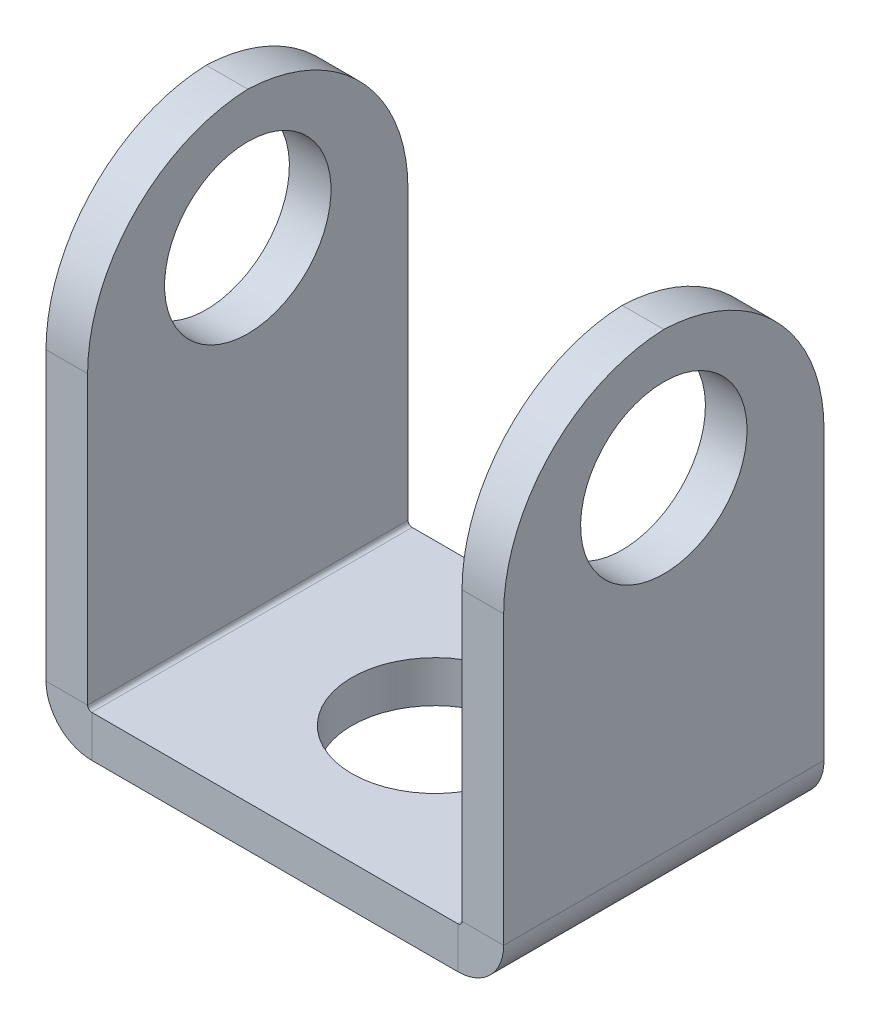
ISO-10303-21;
HEADER;
FILE_DESCRIPTION(('STEP AP214'),'2;1');
FILE_NAME('part.step','',(''),(''),'','','');
FILE_SCHEMA(('AUTOMOTIVE_DESIGN { 1 0 10303 214 1 1 1 1 }'));
ENDSEC;
DATA;
#1=APPLICATION_CONTEXT('core data for automotive mechanical design processes');
#2=APPLICATION_PROTOCOL_DEFINITION('international standard','automotive_design',2000,#1);
#3=PRODUCT_CONTEXT('',#1,'mechanical');
#4=PRODUCT('Part','Part','',(#3));
#5=PRODUCT_RELATED_PRODUCT_CATEGORY('part','',(#4));
#6=PRODUCT_DEFINITION_FORMATION('','',#4);
#7=PRODUCT_DEFINITION_CONTEXT('part definition',#1,'design');
#8=PRODUCT_DEFINITION('design','',#6,#7);
#9=PRODUCT_DEFINITION_SHAPE('','',#8);
#10=(LENGTH_UNIT() NAMED_UNIT(*) SI_UNIT(.MILLI.,.METRE.));
#11=(NAMED_UNIT(*) PLANE_ANGLE_UNIT() SI_UNIT($,.RADIAN.));
#12=(NAMED_UNIT(*) SI_UNIT($,.STERADIAN.) SOLID_ANGLE_UNIT());
#13=UNCERTAINTY_MEASURE_WITH_UNIT(LENGTH_MEASURE(1.E-05),#10,'distance_accuracy_value','');
#14=(GEOMETRIC_REPRESENTATION_CONTEXT(3) GLOBAL_UNCERTAINTY_ASSIGNED_CONTEXT((#13)) GLOBAL_UNIT_ASSIGNED_CONTEXT((#10,
#11,#12)) REPRESENTATION_CONTEXT('',''));
#15=CARTESIAN_POINT('',(0.,0.,0.));
#16=DIRECTION('',(0.,0.,1.));
#17=DIRECTION('',(1.,0.,0.));
#18=AXIS2_PLACEMENT_3D('',#15,#16,#17);
#19=CARTESIAN_POINT('',(4.5,1.,3.85));
#20=DIRECTION('',(0.,1.,0.));
#21=DIRECTION('',(0.,0.,1.));
#22=AXIS2_PLACEMENT_3D('',#19,#20,#21);
#23=PLANE('',#22);
#24=CARTESIAN_POINT('',(0.,1.,0.));
#25=DIRECTION('',(0.,1.,0.));
#26=DIRECTION('',(0.,0.,1.));
#27=AXIS2_PLACEMENT_3D('',#24,#25,#26);
#28=CIRCLE('',#27,2.);
#29=CARTESIAN_POINT('',(0.,1.,2.));
#30=VERTEX_POINT('',#29);
#31=EDGE_CURVE('E236',#30,#30,#28,.T.);
#32=ORIENTED_EDGE('',*,*,#31,.F.);
#33=EDGE_LOOP('',(#32));
#34=FACE_BOUND('',#33,.T.);
#35=DIRECTION('',(-1.,0.,0.));
#36=VECTOR('',#35,1.);
#37=CARTESIAN_POINT('',(-4.5,1.,-3.85));
#38=LINE('',#37,#36);
#39=CARTESIAN_POINT('',(4.4,1.,-3.85));
#40=VERTEX_POINT('',#39);
#41=CARTESIAN_POINT('',(-4.4,1.,-3.85));
#42=VERTEX_POINT('',#41);
#43=EDGE_CURVE('E242',#40,#42,#38,.T.);
#44=ORIENTED_EDGE('',*,*,#43,.T.);
#45=DIRECTION('',(0.,0.,1.));
#46=VECTOR('',#45,1.);
#47=CARTESIAN_POINT('',(-4.4,1.,3.85));
#48=LINE('',#47,#46);
#49=CARTESIAN_POINT('',(-4.4,1.,3.85));
#50=VERTEX_POINT('',#49);
#51=EDGE_CURVE('E179',#50,#42,#48,.F.);
#52=ORIENTED_EDGE('',*,*,#51,.F.);
#53=DIRECTION('',(1.,0.,0.));
#54=VECTOR('',#53,1.);
#55=CARTESIAN_POINT('',(-4.5,1.,3.85));
#56=LINE('',#55,#54);
#57=CARTESIAN_POINT('',(4.4,1.,3.85));
#58=VERTEX_POINT('',#57);
#59=EDGE_CURVE('E245',#50,#58,#56,.T.);
#60=ORIENTED_EDGE('',*,*,#59,.T.);
#61=DIRECTION('',(0.,0.,-1.));
#62=VECTOR('',#61,1.);
#63=CARTESIAN_POINT('',(4.4,1.,-3.85));
#64=LINE('',#63,#62);
#65=EDGE_CURVE('E225',#40,#58,#64,.F.);
#66=ORIENTED_EDGE('',*,*,#65,.F.);
#67=EDGE_LOOP('',(#44,#52,#60,#66));
#68=FACE_BOUND('',#67,.T.);
#69=ADVANCED_FACE('F33',(#34,#68),#23,.T.);
#70=CARTESIAN_POINT('',(4.5,0.,3.85));
#71=DIRECTION('',(0.,1.,0.));
#72=DIRECTION('',(0.,0.,1.));
#73=AXIS2_PLACEMENT_3D('',#70,#71,#72);
#74=PLANE('',#73);
#75=CARTESIAN_POINT('',(0.,0.,0.));
#76=DIRECTION('',(0.,1.,0.));
#77=DIRECTION('',(0.,0.,1.));
#78=AXIS2_PLACEMENT_3D('',#75,#76,#77);
#79=CIRCLE('',#78,2.);
#80=CARTESIAN_POINT('',(0.,0.,2.));
#81=VERTEX_POINT('',#80);
#82=EDGE_CURVE('E233',#81,#81,#79,.T.);
#83=ORIENTED_EDGE('',*,*,#82,.T.);
#84=EDGE_LOOP('',(#83));
#85=FACE_BOUND('',#84,.T.);
#86=DIRECTION('',(0.,0.,1.));
#87=VECTOR('',#86,1.);
#88=CARTESIAN_POINT('',(-4.39999999999999,0.,3.85));
#89=LINE('',#88,#87);
#90=CARTESIAN_POINT('',(-4.39999999999999,0.,3.85));
#91=VERTEX_POINT('',#90);
#92=CARTESIAN_POINT('',(-4.4,0.,-3.85));
#93=VERTEX_POINT('',#92);
#94=EDGE_CURVE('E150',#91,#93,#89,.F.);
#95=ORIENTED_EDGE('',*,*,#94,.T.);
#96=DIRECTION('',(-1.,0.,0.));
#97=VECTOR('',#96,1.);
#98=CARTESIAN_POINT('',(-4.5,0.,-3.85));
#99=LINE('',#98,#97);
#100=CARTESIAN_POINT('',(4.4,0.,-3.85));
#101=VERTEX_POINT('',#100);
#102=EDGE_CURVE('E239',#101,#93,#99,.T.);
#103=ORIENTED_EDGE('',*,*,#102,.F.);
#104=DIRECTION('',(0.,0.,-1.));
#105=VECTOR('',#104,1.);
#106=CARTESIAN_POINT('',(4.4,0.,-3.85));
#107=LINE('',#106,#105);
#108=CARTESIAN_POINT('',(4.4,0.,3.85));
#109=VERTEX_POINT('',#108);
#110=EDGE_CURVE('E212',#101,#109,#107,.F.);
#111=ORIENTED_EDGE('',*,*,#110,.T.);
#112=DIRECTION('',(1.,0.,0.));
#113=VECTOR('',#112,1.);
#114=CARTESIAN_POINT('',(-4.5,0.,3.85));
#115=LINE('',#114,#113);
#116=EDGE_CURVE('E246',#91,#109,#115,.T.);
#117=ORIENTED_EDGE('',*,*,#116,.F.);
#118=EDGE_LOOP('',(#95,#103,#111,#117));
#119=FACE_BOUND('',#118,.T.);
#120=ADVANCED_FACE('F313',(#85,#119),#74,.F.);
#121=CARTESIAN_POINT('',(-4.5,1.,-3.85));
#122=DIRECTION('',(0.,0.,1.));
#123=DIRECTION('',(1.,0.,0.));
#124=AXIS2_PLACEMENT_3D('',#121,#122,#123);
#125=PLANE('',#124);
#126=DIRECTION('',(0.,-1.,0.));
#127=VECTOR('',#126,1.);
#128=CARTESIAN_POINT('',(-4.4,1.,-3.85));
#129=LINE('',#128,#127);
#130=EDGE_CURVE('E183',#42,#93,#129,.T.);
#131=ORIENTED_EDGE('',*,*,#130,.F.);
#132=ORIENTED_EDGE('',*,*,#43,.F.);
#133=DIRECTION('',(0.,-1.,0.));
#134=VECTOR('',#133,1.);
#135=CARTESIAN_POINT('',(4.4,1.,-3.85));
#136=LINE('',#135,#134);
#137=EDGE_CURVE('E219',#40,#101,#136,.T.);
#138=ORIENTED_EDGE('',*,*,#137,.T.);
#139=ORIENTED_EDGE('',*,*,#102,.T.);
#140=EDGE_LOOP('',(#131,#132,#138,#139));
#141=FACE_BOUND('',#140,.T.);
#142=ADVANCED_FACE('F319',(#141),#125,.F.);
#143=CARTESIAN_POINT('',(-4.5,1.,3.85));
#144=DIRECTION('',(0.,0.,-1.));
#145=DIRECTION('',(-1.,0.,0.));
#146=AXIS2_PLACEMENT_3D('',#143,#144,#145);
#147=PLANE('',#146);
#148=DIRECTION('',(0.,-1.,0.));
#149=VECTOR('',#148,1.);
#150=CARTESIAN_POINT('',(-4.4,1.,3.85));
#151=LINE('',#150,#149);
#152=EDGE_CURVE('E175',#50,#91,#151,.T.);
#153=ORIENTED_EDGE('',*,*,#152,.T.);
#154=ORIENTED_EDGE('',*,*,#116,.T.);
#155=DIRECTION('',(0.,-1.,0.));
#156=VECTOR('',#155,1.);
#157=CARTESIAN_POINT('',(4.4,1.,3.85));
#158=LINE('',#157,#156);
#159=EDGE_CURVE('E230',#58,#109,#158,.T.);
#160=ORIENTED_EDGE('',*,*,#159,.F.);
#161=ORIENTED_EDGE('',*,*,#59,.F.);
#162=EDGE_LOOP('',(#153,#154,#160,#161));
#163=FACE_BOUND('',#162,.T.);
#164=ADVANCED_FACE('F328',(#163),#147,.F.);
#165=CARTESIAN_POINT('',(0.,1.,0.));
#166=DIRECTION('',(0.,-1.,0.));
#167=DIRECTION('',(0.,0.,-1.));
#168=AXIS2_PLACEMENT_3D('',#165,#166,#167);
#169=CYLINDRICAL_SURFACE('',#168,2.);
#170=ORIENTED_EDGE('',*,*,#31,.T.);
#171=EDGE_LOOP('',(#170));
#172=FACE_BOUND('',#171,.T.);
#173=ORIENTED_EDGE('',*,*,#82,.F.);
#174=EDGE_LOOP('',(#173));
#175=FACE_BOUND('',#174,.T.);
#176=ADVANCED_FACE('F325',(#172,#175),#169,.F.);
#177=CARTESIAN_POINT('',(4.4,1.1,3.85));
#178=DIRECTION('',(0.,0.,1.));
#179=DIRECTION('',(1.,0.,0.));
#180=AXIS2_PLACEMENT_3D('',#177,#178,#179);
#181=PLANE('',#180);
#182=DIRECTION('',(1.,0.,0.));
#183=VECTOR('',#182,1.);
#184=CARTESIAN_POINT('',(4.5,1.1,3.85));
#185=LINE('',#184,#183);
#186=CARTESIAN_POINT('',(4.5,1.1,3.85));
#187=VERTEX_POINT('',#186);
#188=CARTESIAN_POINT('',(5.5,1.09999999999999,3.85));
#189=VERTEX_POINT('',#188);
#190=EDGE_CURVE('E193',#187,#189,#185,.T.);
#191=ORIENTED_EDGE('',*,*,#190,.F.);
#192=CARTESIAN_POINT('',(4.4,1.1,3.85));
#193=DIRECTION('',(0.,0.,-1.));
#194=DIRECTION('',(-1.,0.,0.));
#195=AXIS2_PLACEMENT_3D('',#192,#193,#194);
#196=CIRCLE('',#195,0.1);
#197=EDGE_CURVE('E222',#58,#187,#196,.F.);
#198=ORIENTED_EDGE('',*,*,#197,.F.);
#199=ORIENTED_EDGE('',*,*,#159,.T.);
#200=CARTESIAN_POINT('',(4.4,1.1,3.85));
#201=DIRECTION('',(0.,0.,-1.));
#202=DIRECTION('',(-1.,0.,0.));
#203=AXIS2_PLACEMENT_3D('',#200,#201,#202);
#204=CIRCLE('',#203,1.1);
#205=EDGE_CURVE('E215',#109,#189,#204,.F.);
#206=ORIENTED_EDGE('',*,*,#205,.T.);
#207=EDGE_LOOP('',(#191,#198,#199,#206));
#208=FACE_BOUND('',#207,.T.);
#209=ADVANCED_FACE('F381',(#208),#181,.T.);
#210=CARTESIAN_POINT('',(4.4,1.1,-3.85));
#211=DIRECTION('',(0.,0.,1.));
#212=DIRECTION('',(1.,0.,0.));
#213=AXIS2_PLACEMENT_3D('',#210,#211,#212);
#214=PLANE('',#213);
#215=CARTESIAN_POINT('',(4.4,1.1,-3.85));
#216=DIRECTION('',(0.,0.,-1.));
#217=DIRECTION('',(-1.,0.,0.));
#218=AXIS2_PLACEMENT_3D('',#215,#216,#217);
#219=CIRCLE('',#218,0.1);
#220=CARTESIAN_POINT('',(4.5,1.1,-3.85));
#221=VERTEX_POINT('',#220);
#222=EDGE_CURVE('E208',#221,#40,#219,.T.);
#223=ORIENTED_EDGE('',*,*,#222,.F.);
#224=DIRECTION('',(1.,0.,0.));
#225=VECTOR('',#224,1.);
#226=CARTESIAN_POINT('',(4.5,1.1,-3.85));
#227=LINE('',#226,#225);
#228=CARTESIAN_POINT('',(5.5,1.1,-3.85));
#229=VERTEX_POINT('',#228);
#230=EDGE_CURVE('E192',#221,#229,#227,.T.);
#231=ORIENTED_EDGE('',*,*,#230,.T.);
#232=CARTESIAN_POINT('',(4.4,1.1,-3.85));
#233=DIRECTION('',(0.,0.,-1.));
#234=DIRECTION('',(-1.,0.,0.));
#235=AXIS2_PLACEMENT_3D('',#232,#233,#234);
#236=CIRCLE('',#235,1.1);
#237=EDGE_CURVE('E216',#229,#101,#236,.T.);
#238=ORIENTED_EDGE('',*,*,#237,.T.);
#239=ORIENTED_EDGE('',*,*,#137,.F.);
#240=EDGE_LOOP('',(#223,#231,#238,#239));
#241=FACE_BOUND('',#240,.T.);
#242=ADVANCED_FACE('F367',(#241),#214,.F.);
#243=CARTESIAN_POINT('',(4.4,1.1,-3.85));
#244=DIRECTION('',(0.,0.,-1.));
#245=DIRECTION('',(1.,0.,0.));
#246=AXIS2_PLACEMENT_3D('',#243,#244,#245);
#247=CYLINDRICAL_SURFACE('',#246,1.1);
#248=ORIENTED_EDGE('',*,*,#110,.F.);
#249=ORIENTED_EDGE('',*,*,#237,.F.);
#250=DIRECTION('',(0.,0.,-1.));
#251=VECTOR('',#250,1.);
#252=CARTESIAN_POINT('',(5.5,1.1,-3.85));
#253=LINE('',#252,#251);
#254=EDGE_CURVE('E196',#189,#229,#253,.T.);
#255=ORIENTED_EDGE('',*,*,#254,.F.);
#256=ORIENTED_EDGE('',*,*,#205,.F.);
#257=EDGE_LOOP('',(#248,#249,#255,#256));
#258=FACE_BOUND('',#257,.T.);
#259=ADVANCED_FACE('F376',(#258),#247,.T.);
#260=CARTESIAN_POINT('',(4.4,1.1,-3.85));
#261=DIRECTION('',(0.,0.,-1.));
#262=DIRECTION('',(1.,0.,0.));
#263=AXIS2_PLACEMENT_3D('',#260,#261,#262);
#264=CYLINDRICAL_SURFACE('',#263,0.1);
#265=ORIENTED_EDGE('',*,*,#65,.T.);
#266=ORIENTED_EDGE('',*,*,#197,.T.);
#267=DIRECTION('',(0.,0.,-1.));
#268=VECTOR('',#267,1.);
#269=CARTESIAN_POINT('',(4.5,1.1,3.85));
#270=LINE('',#269,#268);
#271=EDGE_CURVE('E189',#187,#221,#270,.T.);
#272=ORIENTED_EDGE('',*,*,#271,.T.);
#273=ORIENTED_EDGE('',*,*,#222,.T.);
#274=EDGE_LOOP('',(#265,#266,#272,#273));
#275=FACE_BOUND('',#274,.T.);
#276=ADVANCED_FACE('F362',(#275),#264,.F.);
#277=CARTESIAN_POINT('',(5.5,0.999999999999997,-3.85));
#278=DIRECTION('',(0.,0.,-1.));
#279=DIRECTION('',(0.,1.,0.));
#280=AXIS2_PLACEMENT_3D('',#277,#278,#279);
#281=PLANE('',#280);
#282=DIRECTION('',(0.,-1.,0.));
#283=VECTOR('',#282,1.);
#284=CARTESIAN_POINT('',(4.5,1.,-3.85));
#285=LINE('',#284,#283);
#286=CARTESIAN_POINT('',(4.50000000000002,8.,-3.85));
#287=VERTEX_POINT('',#286);
#288=EDGE_CURVE('E206',#287,#221,#285,.T.);
#289=ORIENTED_EDGE('',*,*,#288,.F.);
#290=DIRECTION('',(-1.,0.,0.));
#291=VECTOR('',#290,1.);
#292=CARTESIAN_POINT('',(5.50000000000002,8.,-3.85));
#293=LINE('',#292,#291);
#294=CARTESIAN_POINT('',(5.50000000000002,8.,-3.85));
#295=VERTEX_POINT('',#294);
#296=EDGE_CURVE('E255',#287,#295,#293,.F.);
#297=ORIENTED_EDGE('',*,*,#296,.T.);
#298=DIRECTION('',(0.,-1.,0.));
#299=VECTOR('',#298,1.);
#300=CARTESIAN_POINT('',(5.5,0.999999999999997,-3.85));
#301=LINE('',#300,#299);
#302=EDGE_CURVE('E205',#295,#229,#301,.T.);
#303=ORIENTED_EDGE('',*,*,#302,.T.);
#304=ORIENTED_EDGE('',*,*,#230,.F.);
#305=EDGE_LOOP('',(#289,#297,#303,#304));
#306=FACE_BOUND('',#305,.T.);
#307=ADVANCED_FACE('F369',(#306),#281,.T.);
#308=CARTESIAN_POINT('',(5.50000000000004,12.,3.85));
#309=DIRECTION('',(0.,0.,1.));
#310=DIRECTION('',(0.,-1.,0.));
#311=AXIS2_PLACEMENT_3D('',#308,#309,#310);
#312=PLANE('',#311);
#313=DIRECTION('',(0.,1.,0.));
#314=VECTOR('',#313,1.);
#315=CARTESIAN_POINT('',(5.50000000000004,12.,3.85));
#316=LINE('',#315,#314);
#317=CARTESIAN_POINT('',(5.50000000000002,8.,3.85));
#318=VERTEX_POINT('',#317);
#319=EDGE_CURVE('E202',#189,#318,#316,.T.);
#320=ORIENTED_EDGE('',*,*,#319,.T.);
#321=DIRECTION('',(-1.,0.,0.));
#322=VECTOR('',#321,1.);
#323=CARTESIAN_POINT('',(5.50000000000002,8.,3.85));
#324=LINE('',#323,#322);
#325=CARTESIAN_POINT('',(4.50000000000002,8.,3.85));
#326=VERTEX_POINT('',#325);
#327=EDGE_CURVE('E262',#318,#326,#324,.T.);
#328=ORIENTED_EDGE('',*,*,#327,.T.);
#329=DIRECTION('',(0.,1.,0.));
#330=VECTOR('',#329,1.);
#331=CARTESIAN_POINT('',(4.50000000000004,12.,3.85));
#332=LINE('',#331,#330);
#333=EDGE_CURVE('E201',#187,#326,#332,.T.);
#334=ORIENTED_EDGE('',*,*,#333,.F.);
#335=ORIENTED_EDGE('',*,*,#190,.T.);
#336=EDGE_LOOP('',(#320,#328,#334,#335));
#337=FACE_BOUND('',#336,.T.);
#338=ADVANCED_FACE('F355',(#337),#312,.T.);
#339=CARTESIAN_POINT('',(5.5,0.999999999999997,-3.85));
#340=DIRECTION('',(1.,0.,0.));
#341=DIRECTION('',(0.,1.,0.));
#342=AXIS2_PLACEMENT_3D('',#339,#340,#341);
#343=PLANE('',#342);
#344=CARTESIAN_POINT('',(5.50000000000003,8.90593735046858,0.));
#345=DIRECTION('',(1.,0.,0.));
#346=DIRECTION('',(0.,1.,0.));
#347=AXIS2_PLACEMENT_3D('',#344,#345,#346);
#348=CIRCLE('',#347,2.);
#349=CARTESIAN_POINT('',(5.50000000000004,10.9059373504686,0.));
#350=VERTEX_POINT('',#349);
#351=EDGE_CURVE('E288',#350,#350,#348,.T.);
#352=ORIENTED_EDGE('',*,*,#351,.F.);
#353=EDGE_LOOP('',(#352));
#354=FACE_BOUND('',#353,.T.);
#355=ORIENTED_EDGE('',*,*,#302,.F.);
#356=CARTESIAN_POINT('',(5.50000000000002,8.,0.15));
#357=DIRECTION('',(1.,0.,0.));
#358=DIRECTION('',(0.,1.,0.));
#359=AXIS2_PLACEMENT_3D('',#356,#357,#358);
#360=CIRCLE('',#359,4.);
#361=CARTESIAN_POINT('',(5.50000000000004,11.9971865105346,0.));
#362=VERTEX_POINT('',#361);
#363=EDGE_CURVE('E260',#295,#362,#360,.T.);
#364=ORIENTED_EDGE('',*,*,#363,.T.);
#365=CARTESIAN_POINT('',(5.50000000000002,8.,-0.150000000000001));
#366=DIRECTION('',(1.,0.,0.));
#367=DIRECTION('',(0.,1.,0.));
#368=AXIS2_PLACEMENT_3D('',#365,#366,#367);
#369=CIRCLE('',#368,4.);
#370=EDGE_CURVE('E258',#362,#318,#369,.T.);
#371=ORIENTED_EDGE('',*,*,#370,.T.);
#372=ORIENTED_EDGE('',*,*,#319,.F.);
#373=ORIENTED_EDGE('',*,*,#254,.T.);
#374=EDGE_LOOP('',(#355,#364,#371,#372,#373));
#375=FACE_BOUND('',#374,.T.);
#376=ADVANCED_FACE('F347',(#354,#375),#343,.T.);
#377=CARTESIAN_POINT('',(4.5,1.,-3.85));
#378=DIRECTION('',(1.,0.,0.));
#379=DIRECTION('',(0.,1.,0.));
#380=AXIS2_PLACEMENT_3D('',#377,#378,#379);
#381=PLANE('',#380);
#382=CARTESIAN_POINT('',(4.50000000000003,8.90593735046859,0.));
#383=DIRECTION('',(1.,0.,0.));
#384=DIRECTION('',(0.,1.,0.));
#385=AXIS2_PLACEMENT_3D('',#382,#383,#384);
#386=CIRCLE('',#385,2.);
#387=CARTESIAN_POINT('',(4.50000000000003,10.9059373504686,0.));
#388=VERTEX_POINT('',#387);
#389=EDGE_CURVE('E276',#388,#388,#386,.T.);
#390=ORIENTED_EDGE('',*,*,#389,.T.);
#391=EDGE_LOOP('',(#390));
#392=FACE_BOUND('',#391,.T.);
#393=CARTESIAN_POINT('',(4.50000000000002,8.,-0.150000000000001));
#394=DIRECTION('',(1.,0.,0.));
#395=DIRECTION('',(0.,1.,0.));
#396=AXIS2_PLACEMENT_3D('',#393,#394,#395);
#397=CIRCLE('',#396,4.);
#398=CARTESIAN_POINT('',(4.50000000000004,11.9971865105346,0.));
#399=VERTEX_POINT('',#398);
#400=EDGE_CURVE('E248',#326,#399,#397,.F.);
#401=ORIENTED_EDGE('',*,*,#400,.T.);
#402=CARTESIAN_POINT('',(4.50000000000002,8.,0.15));
#403=DIRECTION('',(1.,0.,0.));
#404=DIRECTION('',(0.,1.,0.));
#405=AXIS2_PLACEMENT_3D('',#402,#403,#404);
#406=CIRCLE('',#405,4.);
#407=EDGE_CURVE('E253',#399,#287,#406,.F.);
#408=ORIENTED_EDGE('',*,*,#407,.T.);
#409=ORIENTED_EDGE('',*,*,#288,.T.);
#410=ORIENTED_EDGE('',*,*,#271,.F.);
#411=ORIENTED_EDGE('',*,*,#333,.T.);
#412=EDGE_LOOP('',(#401,#408,#409,#410,#411));
#413=FACE_BOUND('',#412,.T.);
#414=ADVANCED_FACE('F342',(#392,#413),#381,.F.);
#415=CARTESIAN_POINT('',(5.50000000000002,8.,-0.150000000000001));
#416=DIRECTION('',(-1.,0.,0.));
#417=DIRECTION('',(0.,-1.,0.));
#418=AXIS2_PLACEMENT_3D('',#415,#416,#417);
#419=CYLINDRICAL_SURFACE('',#418,4.);
#420=ORIENTED_EDGE('',*,*,#327,.F.);
#421=ORIENTED_EDGE('',*,*,#370,.F.);
#422=DIRECTION('',(-1.,0.,0.));
#423=VECTOR('',#422,1.);
#424=CARTESIAN_POINT('',(5.00000000000004,11.9971865105346,0.));
#425=LINE('',#424,#423);
#426=EDGE_CURVE('E186',#399,#362,#425,.F.);
#427=ORIENTED_EDGE('',*,*,#426,.F.);
#428=ORIENTED_EDGE('',*,*,#400,.F.);
#429=EDGE_LOOP('',(#420,#421,#427,#428));
#430=FACE_BOUND('',#429,.T.);
#431=ADVANCED_FACE('F339',(#430),#419,.T.);
#432=CARTESIAN_POINT('',(5.50000000000002,8.,0.15));
#433=DIRECTION('',(-1.,0.,0.));
#434=DIRECTION('',(0.,-1.,0.));
#435=AXIS2_PLACEMENT_3D('',#432,#433,#434);
#436=CYLINDRICAL_SURFACE('',#435,4.);
#437=ORIENTED_EDGE('',*,*,#363,.F.);
#438=ORIENTED_EDGE('',*,*,#296,.F.);
#439=ORIENTED_EDGE('',*,*,#407,.F.);
#440=ORIENTED_EDGE('',*,*,#426,.T.);
#441=EDGE_LOOP('',(#437,#438,#439,#440));
#442=FACE_BOUND('',#441,.T.);
#443=ADVANCED_FACE('F335',(#442),#436,.T.);
#444=CARTESIAN_POINT('',(-4.4,1.1,-3.85));
#445=DIRECTION('',(0.,0.,-1.));
#446=DIRECTION('',(-1.,0.,0.));
#447=AXIS2_PLACEMENT_3D('',#444,#445,#446);
#448=PLANE('',#447);
#449=DIRECTION('',(-1.,0.,0.));
#450=VECTOR('',#449,1.);
#451=CARTESIAN_POINT('',(-4.5,1.1,-3.85));
#452=LINE('',#451,#450);
#453=CARTESIAN_POINT('',(-4.5,1.1,-3.85));
#454=VERTEX_POINT('',#453);
#455=CARTESIAN_POINT('',(-5.5,1.1,-3.85));
#456=VERTEX_POINT('',#455);
#457=EDGE_CURVE('E170',#454,#456,#452,.T.);
#458=ORIENTED_EDGE('',*,*,#457,.F.);
#459=CARTESIAN_POINT('',(-4.4,1.1,-3.85));
#460=DIRECTION('',(0.,0.,1.));
#461=DIRECTION('',(1.,0.,0.));
#462=AXIS2_PLACEMENT_3D('',#459,#460,#461);
#463=CIRCLE('',#462,0.1);
#464=EDGE_CURVE('E153',#42,#454,#463,.F.);
#465=ORIENTED_EDGE('',*,*,#464,.F.);
#466=ORIENTED_EDGE('',*,*,#130,.T.);
#467=CARTESIAN_POINT('',(-4.4,1.1,-3.85));
#468=DIRECTION('',(0.,0.,1.));
#469=DIRECTION('',(1.,0.,0.));
#470=AXIS2_PLACEMENT_3D('',#467,#468,#469);
#471=CIRCLE('',#470,1.1);
#472=EDGE_CURVE('E174',#93,#456,#471,.F.);
#473=ORIENTED_EDGE('',*,*,#472,.T.);
#474=EDGE_LOOP('',(#458,#465,#466,#473));
#475=FACE_BOUND('',#474,.T.);
#476=ADVANCED_FACE('F338',(#475),#448,.T.);
#477=CARTESIAN_POINT('',(-4.4,1.1,3.85));
#478=DIRECTION('',(0.,0.,-1.));
#479=DIRECTION('',(-1.,0.,0.));
#480=AXIS2_PLACEMENT_3D('',#477,#478,#479);
#481=PLANE('',#480);
#482=CARTESIAN_POINT('',(-4.4,1.1,3.85));
#483=DIRECTION('',(0.,0.,1.));
#484=DIRECTION('',(1.,0.,0.));
#485=AXIS2_PLACEMENT_3D('',#482,#483,#484);
#486=CIRCLE('',#485,0.1);
#487=CARTESIAN_POINT('',(-4.5,1.1,3.85));
#488=VERTEX_POINT('',#487);
#489=EDGE_CURVE('E139',#488,#50,#486,.T.);
#490=ORIENTED_EDGE('',*,*,#489,.F.);
#491=DIRECTION('',(-1.,0.,0.));
#492=VECTOR('',#491,1.);
#493=CARTESIAN_POINT('',(-4.5,1.1,3.85));
#494=LINE('',#493,#492);
#495=CARTESIAN_POINT('',(-5.5,1.1,3.85));
#496=VERTEX_POINT('',#495);
#497=EDGE_CURVE('E137',#488,#496,#494,.T.);
#498=ORIENTED_EDGE('',*,*,#497,.T.);
#499=CARTESIAN_POINT('',(-4.4,1.1,3.85));
#500=DIRECTION('',(0.,0.,1.));
#501=DIRECTION('',(1.,0.,0.));
#502=AXIS2_PLACEMENT_3D('',#499,#500,#501);
#503=CIRCLE('',#502,1.1);
#504=EDGE_CURVE('E145',#496,#91,#503,.T.);
#505=ORIENTED_EDGE('',*,*,#504,.T.);
#506=ORIENTED_EDGE('',*,*,#152,.F.);
#507=EDGE_LOOP('',(#490,#498,#505,#506));
#508=FACE_BOUND('',#507,.T.);
#509=ADVANCED_FACE('F156',(#508),#481,.F.);
#510=CARTESIAN_POINT('',(-4.4,1.1,3.85));
#511=DIRECTION('',(0.,0.,1.));
#512=DIRECTION('',(-1.,0.,0.));
#513=AXIS2_PLACEMENT_3D('',#510,#511,#512);
#514=CYLINDRICAL_SURFACE('',#513,1.1);
#515=ORIENTED_EDGE('',*,*,#94,.F.);
#516=ORIENTED_EDGE('',*,*,#504,.F.);
#517=DIRECTION('',(0.,0.,1.));
#518=VECTOR('',#517,1.);
#519=CARTESIAN_POINT('',(-5.5,1.1,3.85));
#520=LINE('',#519,#518);
#521=EDGE_CURVE('E148',#456,#496,#520,.T.);
#522=ORIENTED_EDGE('',*,*,#521,.F.);
#523=ORIENTED_EDGE('',*,*,#472,.F.);
#524=EDGE_LOOP('',(#515,#516,#522,#523));
#525=FACE_BOUND('',#524,.T.);
#526=ADVANCED_FACE('F146',(#525),#514,.T.);
#527=CARTESIAN_POINT('',(-4.4,1.1,3.85));
#528=DIRECTION('',(0.,0.,1.));
#529=DIRECTION('',(-1.,0.,0.));
#530=AXIS2_PLACEMENT_3D('',#527,#528,#529);
#531=CYLINDRICAL_SURFACE('',#530,0.1);
#532=ORIENTED_EDGE('',*,*,#51,.T.);
#533=ORIENTED_EDGE('',*,*,#464,.T.);
#534=DIRECTION('',(0.,0.,1.));
#535=VECTOR('',#534,1.);
#536=CARTESIAN_POINT('',(-4.5,1.1,-3.85));
#537=LINE('',#536,#535);
#538=EDGE_CURVE('E158',#454,#488,#537,.T.);
#539=ORIENTED_EDGE('',*,*,#538,.T.);
#540=ORIENTED_EDGE('',*,*,#489,.T.);
#541=EDGE_LOOP('',(#532,#533,#539,#540));
#542=FACE_BOUND('',#541,.T.);
#543=ADVANCED_FACE('F293',(#542),#531,.F.);
#544=CARTESIAN_POINT('',(-5.5,0.999999999999997,3.85));
#545=DIRECTION('',(0.,0.,1.));
#546=DIRECTION('',(0.,-1.,0.));
#547=AXIS2_PLACEMENT_3D('',#544,#545,#546);
#548=PLANE('',#547);
#549=DIRECTION('',(0.,-1.,0.));
#550=VECTOR('',#549,1.);
#551=CARTESIAN_POINT('',(-4.5,1.,3.85));
#552=LINE('',#551,#550);
#553=CARTESIAN_POINT('',(-4.50000000000002,8.,3.85));
#554=VERTEX_POINT('',#553);
#555=EDGE_CURVE('E166',#554,#488,#552,.T.);
#556=ORIENTED_EDGE('',*,*,#555,.F.);
#557=DIRECTION('',(1.,0.,0.));
#558=VECTOR('',#557,1.);
#559=CARTESIAN_POINT('',(-5.50000000000002,8.,3.85));
#560=LINE('',#559,#558);
#561=CARTESIAN_POINT('',(-5.50000000000002,8.,3.85));
#562=VERTEX_POINT('',#561);
#563=EDGE_CURVE('E11',#554,#562,#560,.F.);
#564=ORIENTED_EDGE('',*,*,#563,.T.);
#565=DIRECTION('',(0.,-1.,0.));
#566=VECTOR('',#565,1.);
#567=CARTESIAN_POINT('',(-5.5,0.999999999999997,3.85));
#568=LINE('',#567,#566);
#569=EDGE_CURVE('E133',#562,#496,#568,.T.);
#570=ORIENTED_EDGE('',*,*,#569,.T.);
#571=ORIENTED_EDGE('',*,*,#497,.F.);
#572=EDGE_LOOP('',(#556,#564,#570,#571));
#573=FACE_BOUND('',#572,.T.);
#574=ADVANCED_FACE('F135',(#573),#548,.T.);
#575=CARTESIAN_POINT('',(-5.50000000000004,12.,-3.85));
#576=DIRECTION('',(0.,0.,-1.));
#577=DIRECTION('',(-1.,0.,0.));
#578=AXIS2_PLACEMENT_3D('',#575,#576,#577);
#579=PLANE('',#578);
#580=DIRECTION('',(0.,1.,0.));
#581=VECTOR('',#580,1.);
#582=CARTESIAN_POINT('',(-5.50000000000004,12.,-3.85));
#583=LINE('',#582,#581);
#584=CARTESIAN_POINT('',(-5.50000000000003,8.,-3.85));
#585=VERTEX_POINT('',#584);
#586=EDGE_CURVE('E140',#456,#585,#583,.T.);
#587=ORIENTED_EDGE('',*,*,#586,.T.);
#588=DIRECTION('',(1.,0.,0.));
#589=VECTOR('',#588,1.);
#590=CARTESIAN_POINT('',(-5.50000000000003,8.,-3.85));
#591=LINE('',#590,#589);
#592=CARTESIAN_POINT('',(-4.50000000000003,8.,-3.85));
#593=VERTEX_POINT('',#592);
#594=EDGE_CURVE('E264',#585,#593,#591,.T.);
#595=ORIENTED_EDGE('',*,*,#594,.T.);
#596=DIRECTION('',(0.,1.,0.));
#597=VECTOR('',#596,1.);
#598=CARTESIAN_POINT('',(-4.50000000000004,12.,-3.85));
#599=LINE('',#598,#597);
#600=EDGE_CURVE('E163',#454,#593,#599,.T.);
#601=ORIENTED_EDGE('',*,*,#600,.F.);
#602=ORIENTED_EDGE('',*,*,#457,.T.);
#603=EDGE_LOOP('',(#587,#595,#601,#602));
#604=FACE_BOUND('',#603,.T.);
#605=ADVANCED_FACE('F299',(#604),#579,.T.);
#606=CARTESIAN_POINT('',(-5.5,0.999999999999997,3.85));
#607=DIRECTION('',(-1.,0.,0.));
#608=DIRECTION('',(0.,-1.,0.));
#609=AXIS2_PLACEMENT_3D('',#606,#607,#608);
#610=PLANE('',#609);
#611=CARTESIAN_POINT('',(-5.50000000000005,8.90593735046862,0.));
#612=DIRECTION('',(1.,0.,0.));
#613=DIRECTION('',(0.,1.,0.));
#614=AXIS2_PLACEMENT_3D('',#611,#612,#613);
#615=CIRCLE('',#614,2.);
#616=CARTESIAN_POINT('',(-5.50000000000004,10.9059373504686,0.));
#617=VERTEX_POINT('',#616);
#618=EDGE_CURVE('E285',#617,#617,#615,.T.);
#619=ORIENTED_EDGE('',*,*,#618,.T.);
#620=EDGE_LOOP('',(#619));
#621=FACE_BOUND('',#620,.T.);
#622=CARTESIAN_POINT('',(-5.50000000000003,8.,-0.150000000000001));
#623=DIRECTION('',(-1.,0.,0.));
#624=DIRECTION('',(0.,-1.,0.));
#625=AXIS2_PLACEMENT_3D('',#622,#623,#624);
#626=CIRCLE('',#625,4.);
#627=CARTESIAN_POINT('',(-5.50000000000004,11.9971865105346,0.));
#628=VERTEX_POINT('',#627);
#629=EDGE_CURVE('E50',#562,#628,#626,.T.);
#630=ORIENTED_EDGE('',*,*,#629,.T.);
#631=CARTESIAN_POINT('',(-5.50000000000002,8.,0.149999999999999));
#632=DIRECTION('',(-1.,0.,0.));
#633=DIRECTION('',(0.,-1.,0.));
#634=AXIS2_PLACEMENT_3D('',#631,#632,#633);
#635=CIRCLE('',#634,4.);
#636=EDGE_CURVE('E42',#628,#585,#635,.T.);
#637=ORIENTED_EDGE('',*,*,#636,.T.);
#638=ORIENTED_EDGE('',*,*,#586,.F.);
#639=ORIENTED_EDGE('',*,*,#521,.T.);
#640=ORIENTED_EDGE('',*,*,#569,.F.);
#641=EDGE_LOOP('',(#630,#637,#638,#639,#640));
#642=FACE_BOUND('',#641,.T.);
#643=ADVANCED_FACE('F161',(#621,#642),#610,.T.);
#644=CARTESIAN_POINT('',(-4.5,1.,3.85));
#645=DIRECTION('',(-1.,0.,0.));
#646=DIRECTION('',(0.,-1.,0.));
#647=AXIS2_PLACEMENT_3D('',#644,#645,#646);
#648=PLANE('',#647);
#649=CARTESIAN_POINT('',(-4.50000000000003,8.90593735046862,0.));
#650=DIRECTION('',(-1.,0.,0.));
#651=DIRECTION('',(0.,-1.,0.));
#652=AXIS2_PLACEMENT_3D('',#649,#650,#651);
#653=CIRCLE('',#652,2.);
#654=CARTESIAN_POINT('',(-4.50000000000002,6.90593735046862,0.));
#655=VERTEX_POINT('',#654);
#656=EDGE_CURVE('E37',#655,#655,#653,.T.);
#657=ORIENTED_EDGE('',*,*,#656,.T.);
#658=EDGE_LOOP('',(#657));
#659=FACE_BOUND('',#658,.T.);
#660=ORIENTED_EDGE('',*,*,#600,.T.);
#661=CARTESIAN_POINT('',(-4.50000000000002,8.,0.149999999999999));
#662=DIRECTION('',(-1.,0.,0.));
#663=DIRECTION('',(0.,-1.,0.));
#664=AXIS2_PLACEMENT_3D('',#661,#662,#663);
#665=CIRCLE('',#664,4.);
#666=CARTESIAN_POINT('',(-4.50000000000004,11.9971865105346,0.));
#667=VERTEX_POINT('',#666);
#668=EDGE_CURVE('E271',#593,#667,#665,.F.);
#669=ORIENTED_EDGE('',*,*,#668,.T.);
#670=CARTESIAN_POINT('',(-4.50000000000002,8.,-0.150000000000001));
#671=DIRECTION('',(-1.,0.,0.));
#672=DIRECTION('',(0.,-1.,0.));
#673=AXIS2_PLACEMENT_3D('',#670,#671,#672);
#674=CIRCLE('',#673,4.);
#675=EDGE_CURVE('E269',#667,#554,#674,.F.);
#676=ORIENTED_EDGE('',*,*,#675,.T.);
#677=ORIENTED_EDGE('',*,*,#555,.T.);
#678=ORIENTED_EDGE('',*,*,#538,.F.);
#679=EDGE_LOOP('',(#660,#669,#676,#677,#678));
#680=FACE_BOUND('',#679,.T.);
#681=ADVANCED_FACE('F297',(#659,#680),#648,.F.);
#682=CARTESIAN_POINT('',(-5.50000000000003,8.,-0.150000000000001));
#683=DIRECTION('',(1.,0.,0.));
#684=DIRECTION('',(0.,1.,0.));
#685=AXIS2_PLACEMENT_3D('',#682,#683,#684);
#686=CYLINDRICAL_SURFACE('',#685,4.);
#687=DIRECTION('',(1.,0.,0.));
#688=VECTOR('',#687,1.);
#689=CARTESIAN_POINT('',(-5.00000000000004,11.9971865105346,0.));
#690=LINE('',#689,#688);
#691=EDGE_CURVE('E274',#628,#667,#690,.T.);
#692=ORIENTED_EDGE('',*,*,#691,.F.);
#693=ORIENTED_EDGE('',*,*,#629,.F.);
#694=ORIENTED_EDGE('',*,*,#563,.F.);
#695=ORIENTED_EDGE('',*,*,#675,.F.);
#696=EDGE_LOOP('',(#692,#693,#694,#695));
#697=FACE_BOUND('',#696,.T.);
#698=ADVANCED_FACE('F35',(#697),#686,.T.);
#699=CARTESIAN_POINT('',(-5.50000000000002,8.,0.149999999999999));
#700=DIRECTION('',(1.,0.,0.));
#701=DIRECTION('',(0.,1.,0.));
#702=AXIS2_PLACEMENT_3D('',#699,#700,#701);
#703=CYLINDRICAL_SURFACE('',#702,4.);
#704=ORIENTED_EDGE('',*,*,#636,.F.);
#705=ORIENTED_EDGE('',*,*,#691,.T.);
#706=ORIENTED_EDGE('',*,*,#668,.F.);
#707=ORIENTED_EDGE('',*,*,#594,.F.);
#708=EDGE_LOOP('',(#704,#705,#706,#707));
#709=FACE_BOUND('',#708,.T.);
#710=ADVANCED_FACE('F301',(#709),#703,.T.);
#711=CARTESIAN_POINT('',(-5.50000000000005,8.90593735046862,0.));
#712=DIRECTION('',(1.,0.,0.));
#713=DIRECTION('',(0.,1.,0.));
#714=AXIS2_PLACEMENT_3D('',#711,#712,#713);
#715=CYLINDRICAL_SURFACE('',#714,2.);
#716=ORIENTED_EDGE('',*,*,#618,.F.);
#717=EDGE_LOOP('',(#716));
#718=FACE_BOUND('',#717,.T.);
#719=ORIENTED_EDGE('',*,*,#656,.F.);
#720=EDGE_LOOP('',(#719));
#721=FACE_BOUND('',#720,.T.);
#722=ADVANCED_FACE('F309',(#718,#721),#715,.F.);
#723=ORIENTED_EDGE('',*,*,#351,.T.);
#724=EDGE_LOOP('',(#723));
#725=FACE_BOUND('',#724,.T.);
#726=ORIENTED_EDGE('',*,*,#389,.F.);
#727=EDGE_LOOP('',(#726));
#728=FACE_BOUND('',#727,.T.);
#729=ADVANCED_FACE('F405',(#725,#728),#715,.F.);
#730=CLOSED_SHELL('',(#69,#120,#142,#164,#176,#209,#242,#259,#276,#307,#338,#376,#414,#431,#443,
#476,#509,#526,#543,#574,#605,#643,#681,#698,#710,#722,#729));
#731=MANIFOLD_SOLID_BREP('B2',#730);
#732=ADVANCED_BREP_SHAPE_REPRESENTATION('',(#18,#731),#14);
#733=SHAPE_DEFINITION_REPRESENTATION(#9,#732);
ENDSEC;
END-ISO-10303-21;
